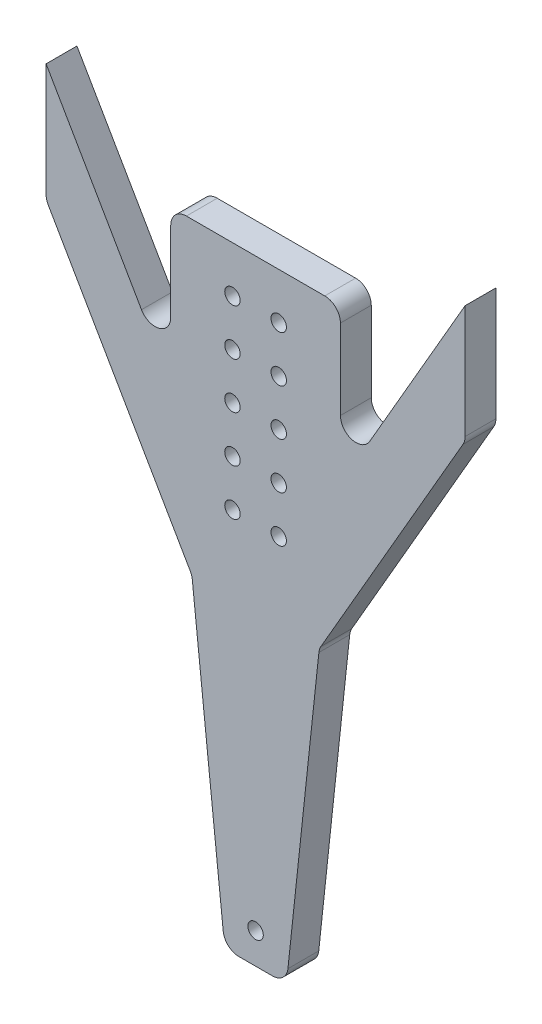
ISO-10303-21;
HEADER;
FILE_DESCRIPTION(('STEP AP214'),'2;1');
FILE_NAME('part.step','',(''),(''),'','','');
FILE_SCHEMA(('AUTOMOTIVE_DESIGN { 1 0 10303 214 1 1 1 1 }'));
ENDSEC;
DATA;
#1=APPLICATION_CONTEXT('core data for automotive mechanical design processes');
#2=APPLICATION_PROTOCOL_DEFINITION('international standard','automotive_design',2000,#1);
#3=PRODUCT_CONTEXT('',#1,'mechanical');
#4=PRODUCT('Part','Part','',(#3));
#5=PRODUCT_RELATED_PRODUCT_CATEGORY('part','',(#4));
#6=PRODUCT_DEFINITION_FORMATION('','',#4);
#7=PRODUCT_DEFINITION_CONTEXT('part definition',#1,'design');
#8=PRODUCT_DEFINITION('design','',#6,#7);
#9=PRODUCT_DEFINITION_SHAPE('','',#8);
#10=(LENGTH_UNIT() NAMED_UNIT(*) SI_UNIT(.MILLI.,.METRE.));
#11=(NAMED_UNIT(*) PLANE_ANGLE_UNIT() SI_UNIT($,.RADIAN.));
#12=(NAMED_UNIT(*) SI_UNIT($,.STERADIAN.) SOLID_ANGLE_UNIT());
#13=UNCERTAINTY_MEASURE_WITH_UNIT(LENGTH_MEASURE(1.E-05),#10,'distance_accuracy_value','');
#14=(GEOMETRIC_REPRESENTATION_CONTEXT(3) GLOBAL_UNCERTAINTY_ASSIGNED_CONTEXT((#13)) GLOBAL_UNIT_ASSIGNED_CONTEXT((#10,
#11,#12)) REPRESENTATION_CONTEXT('',''));
#15=CARTESIAN_POINT('',(0.,0.,0.));
#16=DIRECTION('',(0.,0.,1.));
#17=DIRECTION('',(1.,0.,0.));
#18=AXIS2_PLACEMENT_3D('',#15,#16,#17);
#19=CARTESIAN_POINT('',(7.5000000000001,85.,0.));
#20=DIRECTION('',(0.,0.,-1.));
#21=DIRECTION('',(-1.,0.,0.));
#22=AXIS2_PLACEMENT_3D('',#19,#20,#21);
#23=CYLINDRICAL_SURFACE('',#22,2.5);
#24=CARTESIAN_POINT('',(7.5000000000001,85.,10.));
#25=DIRECTION('',(0.,0.,-1.));
#26=DIRECTION('',(-1.,0.,0.));
#27=AXIS2_PLACEMENT_3D('',#24,#25,#26);
#28=CIRCLE('',#27,2.5);
#29=CARTESIAN_POINT('',(5.0000000000001,85.,10.));
#30=VERTEX_POINT('',#29);
#31=EDGE_CURVE('E49',#30,#30,#28,.T.);
#32=ORIENTED_EDGE('',*,*,#31,.F.);
#33=EDGE_LOOP('',(#32));
#34=FACE_BOUND('',#33,.T.);
#35=CARTESIAN_POINT('',(7.5000000000001,85.,0.));
#36=DIRECTION('',(0.,0.,-1.));
#37=DIRECTION('',(-1.,0.,0.));
#38=AXIS2_PLACEMENT_3D('',#35,#36,#37);
#39=CIRCLE('',#38,2.5);
#40=CARTESIAN_POINT('',(5.0000000000001,85.,0.));
#41=VERTEX_POINT('',#40);
#42=EDGE_CURVE('E11',#41,#41,#39,.T.);
#43=ORIENTED_EDGE('',*,*,#42,.T.);
#44=EDGE_LOOP('',(#43));
#45=FACE_BOUND('',#44,.T.);
#46=ADVANCED_FACE('F41',(#34,#45),#23,.F.);
#47=CARTESIAN_POINT('',(7.50000000000008,70.,0.));
#48=DIRECTION('',(0.,0.,-1.));
#49=DIRECTION('',(-1.,0.,0.));
#50=AXIS2_PLACEMENT_3D('',#47,#48,#49);
#51=CYLINDRICAL_SURFACE('',#50,2.5);
#52=CARTESIAN_POINT('',(7.50000000000008,70.,10.));
#53=DIRECTION('',(0.,0.,-1.));
#54=DIRECTION('',(-1.,0.,0.));
#55=AXIS2_PLACEMENT_3D('',#52,#53,#54);
#56=CIRCLE('',#55,2.5);
#57=CARTESIAN_POINT('',(5.00000000000008,70.,10.));
#58=VERTEX_POINT('',#57);
#59=EDGE_CURVE('E463',#58,#58,#56,.T.);
#60=ORIENTED_EDGE('',*,*,#59,.F.);
#61=EDGE_LOOP('',(#60));
#62=FACE_BOUND('',#61,.T.);
#63=CARTESIAN_POINT('',(7.50000000000008,70.,0.));
#64=DIRECTION('',(0.,0.,-1.));
#65=DIRECTION('',(-1.,0.,0.));
#66=AXIS2_PLACEMENT_3D('',#63,#64,#65);
#67=CIRCLE('',#66,2.5);
#68=CARTESIAN_POINT('',(5.00000000000008,70.,0.));
#69=VERTEX_POINT('',#68);
#70=EDGE_CURVE('E467',#69,#69,#67,.T.);
#71=ORIENTED_EDGE('',*,*,#70,.T.);
#72=EDGE_LOOP('',(#71));
#73=FACE_BOUND('',#72,.T.);
#74=ADVANCED_FACE('F477',(#62,#73),#51,.F.);
#75=CARTESIAN_POINT('',(7.50000000000005,55.,0.));
#76=DIRECTION('',(0.,0.,-1.));
#77=DIRECTION('',(-1.,0.,0.));
#78=AXIS2_PLACEMENT_3D('',#75,#76,#77);
#79=CYLINDRICAL_SURFACE('',#78,2.5);
#80=CARTESIAN_POINT('',(7.50000000000005,55.,10.));
#81=DIRECTION('',(0.,0.,-1.));
#82=DIRECTION('',(-1.,0.,0.));
#83=AXIS2_PLACEMENT_3D('',#80,#81,#82);
#84=CIRCLE('',#83,2.5);
#85=CARTESIAN_POINT('',(5.00000000000005,55.,10.));
#86=VERTEX_POINT('',#85);
#87=EDGE_CURVE('E455',#86,#86,#84,.T.);
#88=ORIENTED_EDGE('',*,*,#87,.F.);
#89=EDGE_LOOP('',(#88));
#90=FACE_BOUND('',#89,.T.);
#91=CARTESIAN_POINT('',(7.50000000000005,55.,0.));
#92=DIRECTION('',(0.,0.,-1.));
#93=DIRECTION('',(-1.,0.,0.));
#94=AXIS2_PLACEMENT_3D('',#91,#92,#93);
#95=CIRCLE('',#94,2.5);
#96=CARTESIAN_POINT('',(5.00000000000005,55.,0.));
#97=VERTEX_POINT('',#96);
#98=EDGE_CURVE('E459',#97,#97,#95,.T.);
#99=ORIENTED_EDGE('',*,*,#98,.T.);
#100=EDGE_LOOP('',(#99));
#101=FACE_BOUND('',#100,.T.);
#102=ADVANCED_FACE('F588',(#90,#101),#79,.F.);
#103=CARTESIAN_POINT('',(-7.4999999999999,85.,0.));
#104=DIRECTION('',(0.,0.,-1.));
#105=DIRECTION('',(-1.,0.,0.));
#106=AXIS2_PLACEMENT_3D('',#103,#104,#105);
#107=CYLINDRICAL_SURFACE('',#106,2.5);
#108=CARTESIAN_POINT('',(-7.4999999999999,85.,10.));
#109=DIRECTION('',(0.,0.,-1.));
#110=DIRECTION('',(-1.,0.,0.));
#111=AXIS2_PLACEMENT_3D('',#108,#109,#110);
#112=CIRCLE('',#111,2.5);
#113=CARTESIAN_POINT('',(-9.99999999999989,85.,10.));
#114=VERTEX_POINT('',#113);
#115=EDGE_CURVE('E447',#114,#114,#112,.T.);
#116=ORIENTED_EDGE('',*,*,#115,.F.);
#117=EDGE_LOOP('',(#116));
#118=FACE_BOUND('',#117,.T.);
#119=CARTESIAN_POINT('',(-7.4999999999999,85.,0.));
#120=DIRECTION('',(0.,0.,-1.));
#121=DIRECTION('',(-1.,0.,0.));
#122=AXIS2_PLACEMENT_3D('',#119,#120,#121);
#123=CIRCLE('',#122,2.5);
#124=CARTESIAN_POINT('',(-9.9999999999999,85.,0.));
#125=VERTEX_POINT('',#124);
#126=EDGE_CURVE('E451',#125,#125,#123,.T.);
#127=ORIENTED_EDGE('',*,*,#126,.T.);
#128=EDGE_LOOP('',(#127));
#129=FACE_BOUND('',#128,.T.);
#130=ADVANCED_FACE('F584',(#118,#129),#107,.F.);
#131=CARTESIAN_POINT('',(-7.49999999999992,70.,0.));
#132=DIRECTION('',(0.,0.,-1.));
#133=DIRECTION('',(-1.,0.,0.));
#134=AXIS2_PLACEMENT_3D('',#131,#132,#133);
#135=CYLINDRICAL_SURFACE('',#134,2.5);
#136=CARTESIAN_POINT('',(-7.49999999999992,70.,10.));
#137=DIRECTION('',(0.,0.,-1.));
#138=DIRECTION('',(-1.,0.,0.));
#139=AXIS2_PLACEMENT_3D('',#136,#137,#138);
#140=CIRCLE('',#139,2.5);
#141=CARTESIAN_POINT('',(-9.99999999999992,70.,10.));
#142=VERTEX_POINT('',#141);
#143=EDGE_CURVE('E439',#142,#142,#140,.T.);
#144=ORIENTED_EDGE('',*,*,#143,.F.);
#145=EDGE_LOOP('',(#144));
#146=FACE_BOUND('',#145,.T.);
#147=CARTESIAN_POINT('',(-7.49999999999992,70.,0.));
#148=DIRECTION('',(0.,0.,-1.));
#149=DIRECTION('',(-1.,0.,0.));
#150=AXIS2_PLACEMENT_3D('',#147,#148,#149);
#151=CIRCLE('',#150,2.5);
#152=CARTESIAN_POINT('',(-9.99999999999992,70.,0.));
#153=VERTEX_POINT('',#152);
#154=EDGE_CURVE('E443',#153,#153,#151,.T.);
#155=ORIENTED_EDGE('',*,*,#154,.T.);
#156=EDGE_LOOP('',(#155));
#157=FACE_BOUND('',#156,.T.);
#158=ADVANCED_FACE('F580',(#146,#157),#135,.F.);
#159=CARTESIAN_POINT('',(-7.49999999999995,55.,0.));
#160=DIRECTION('',(0.,0.,-1.));
#161=DIRECTION('',(-1.,0.,0.));
#162=AXIS2_PLACEMENT_3D('',#159,#160,#161);
#163=CYLINDRICAL_SURFACE('',#162,2.5);
#164=CARTESIAN_POINT('',(-7.49999999999995,55.,10.));
#165=DIRECTION('',(0.,0.,-1.));
#166=DIRECTION('',(-1.,0.,0.));
#167=AXIS2_PLACEMENT_3D('',#164,#165,#166);
#168=CIRCLE('',#167,2.5);
#169=CARTESIAN_POINT('',(-9.99999999999994,55.,10.));
#170=VERTEX_POINT('',#169);
#171=EDGE_CURVE('E431',#170,#170,#168,.T.);
#172=ORIENTED_EDGE('',*,*,#171,.F.);
#173=EDGE_LOOP('',(#172));
#174=FACE_BOUND('',#173,.T.);
#175=CARTESIAN_POINT('',(-7.49999999999995,55.,0.));
#176=DIRECTION('',(0.,0.,-1.));
#177=DIRECTION('',(-1.,0.,0.));
#178=AXIS2_PLACEMENT_3D('',#175,#176,#177);
#179=CIRCLE('',#178,2.5);
#180=CARTESIAN_POINT('',(-9.99999999999995,55.,0.));
#181=VERTEX_POINT('',#180);
#182=EDGE_CURVE('E435',#181,#181,#179,.T.);
#183=ORIENTED_EDGE('',*,*,#182,.T.);
#184=EDGE_LOOP('',(#183));
#185=FACE_BOUND('',#184,.T.);
#186=ADVANCED_FACE('F539',(#174,#185),#163,.F.);
#187=CARTESIAN_POINT('',(-27.5104682033564,50.,10.));
#188=DIRECTION('',(1.,0.,0.));
#189=DIRECTION('',(0.,0.,-1.));
#190=AXIS2_PLACEMENT_3D('',#187,#188,#189);
#191=PLANE('',#190);
#192=DIRECTION('',(0.,-1.,0.));
#193=VECTOR('',#192,1.);
#194=CARTESIAN_POINT('',(-27.5104682033564,50.,10.));
#195=LINE('',#194,#193);
#196=CARTESIAN_POINT('',(-27.5104682033564,94.9200000000001,10.));
#197=VERTEX_POINT('',#196);
#198=CARTESIAN_POINT('',(-27.5104682033564,68.9588181024498,10.));
#199=VERTEX_POINT('',#198);
#200=EDGE_CURVE('E207',#197,#199,#195,.T.);
#201=ORIENTED_EDGE('',*,*,#200,.F.);
#202=DIRECTION('',(0.,0.,-1.));
#203=VECTOR('',#202,1.);
#204=CARTESIAN_POINT('',(-27.5104682033564,94.9200000000001,10.));
#205=LINE('',#204,#203);
#206=CARTESIAN_POINT('',(-27.5104682033564,94.9200000000001,0.));
#207=VERTEX_POINT('',#206);
#208=EDGE_CURVE('E358',#197,#207,#205,.T.);
#209=ORIENTED_EDGE('',*,*,#208,.T.);
#210=DIRECTION('',(0.,-1.,0.));
#211=VECTOR('',#210,1.);
#212=CARTESIAN_POINT('',(-27.5104682033564,50.,0.));
#213=LINE('',#212,#211);
#214=CARTESIAN_POINT('',(-27.5104682033564,68.9588181024498,0.));
#215=VERTEX_POINT('',#214);
#216=EDGE_CURVE('E260',#207,#215,#213,.T.);
#217=ORIENTED_EDGE('',*,*,#216,.T.);
#218=DIRECTION('',(0.,0.,-1.));
#219=VECTOR('',#218,1.);
#220=CARTESIAN_POINT('',(-27.5104682033564,68.9588181024498,10.));
#221=LINE('',#220,#219);
#222=EDGE_CURVE('E355',#215,#199,#221,.F.);
#223=ORIENTED_EDGE('',*,*,#222,.T.);
#224=EDGE_LOOP('',(#201,#209,#217,#223));
#225=FACE_BOUND('',#224,.T.);
#226=ADVANCED_FACE('F537',(#225),#191,.F.);
#227=CARTESIAN_POINT('',(-67.9249870466306,120.,10.));
#228=DIRECTION('',(-0.866025403784437,-0.500000000000004,0.));
#229=DIRECTION('',(0.500000000000004,-0.866025403784437,0.));
#230=AXIS2_PLACEMENT_3D('',#227,#228,#229);
#231=PLANE('',#230);
#232=DIRECTION('',(-0.500000000000004,0.866025403784437,0.));
#233=VECTOR('',#232,1.);
#234=CARTESIAN_POINT('',(-67.9249870466306,120.,10.));
#235=LINE('',#234,#233);
#236=CARTESIAN_POINT('',(-36.9898772545813,66.4188181024497,10.));
#237=VERTEX_POINT('',#236);
#238=CARTESIAN_POINT('',(-67.9249870466306,120.,10.));
#239=VERTEX_POINT('',#238);
#240=EDGE_CURVE('E192',#237,#239,#235,.T.);
#241=ORIENTED_EDGE('',*,*,#240,.F.);
#242=DIRECTION('',(0.,0.,-1.));
#243=VECTOR('',#242,1.);
#244=CARTESIAN_POINT('',(-36.9898772545813,66.4188181024498,0.));
#245=LINE('',#244,#243);
#246=CARTESIAN_POINT('',(-36.9898772545813,66.4188181024497,0.));
#247=VERTEX_POINT('',#246);
#248=EDGE_CURVE('E364',#237,#247,#245,.T.);
#249=ORIENTED_EDGE('',*,*,#248,.T.);
#250=DIRECTION('',(-0.500000000000004,0.866025403784437,0.));
#251=VECTOR('',#250,1.);
#252=CARTESIAN_POINT('',(-67.9249870466306,120.,0.));
#253=LINE('',#252,#251);
#254=CARTESIAN_POINT('',(-67.9249870466306,120.,0.));
#255=VERTEX_POINT('',#254);
#256=EDGE_CURVE('E213',#247,#255,#253,.T.);
#257=ORIENTED_EDGE('',*,*,#256,.T.);
#258=DIRECTION('',(0.,0.,-1.));
#259=VECTOR('',#258,1.);
#260=CARTESIAN_POINT('',(-67.9249870466306,120.,10.));
#261=LINE('',#260,#259);
#262=EDGE_CURVE('E210',#239,#255,#261,.T.);
#263=ORIENTED_EDGE('',*,*,#262,.F.);
#264=EDGE_LOOP('',(#241,#249,#257,#263));
#265=FACE_BOUND('',#264,.T.);
#266=ADVANCED_FACE('F211',(#265),#231,.F.);
#267=CARTESIAN_POINT('',(-67.9249870466306,120.,10.));
#268=DIRECTION('',(1.,0.,0.));
#269=DIRECTION('',(0.,0.,-1.));
#270=AXIS2_PLACEMENT_3D('',#267,#268,#269);
#271=PLANE('',#270);
#272=DIRECTION('',(0.,-1.,0.));
#273=VECTOR('',#272,1.);
#274=CARTESIAN_POINT('',(-67.9249870466306,120.,0.));
#275=LINE('',#274,#273);
#276=CARTESIAN_POINT('',(-67.9249870466306,83.261181897551,0.));
#277=VERTEX_POINT('',#276);
#278=EDGE_CURVE('E267',#255,#277,#275,.T.);
#279=ORIENTED_EDGE('',*,*,#278,.T.);
#280=DIRECTION('',(0.,0.,-1.));
#281=VECTOR('',#280,1.);
#282=CARTESIAN_POINT('',(-67.9249870466306,83.261181897551,10.));
#283=LINE('',#282,#281);
#284=CARTESIAN_POINT('',(-67.9249870466306,83.261181897551,10.));
#285=VERTEX_POINT('',#284);
#286=EDGE_CURVE('E223',#277,#285,#283,.F.);
#287=ORIENTED_EDGE('',*,*,#286,.T.);
#288=DIRECTION('',(0.,-1.,0.));
#289=VECTOR('',#288,1.);
#290=CARTESIAN_POINT('',(-67.9249870466306,120.,10.));
#291=LINE('',#290,#289);
#292=EDGE_CURVE('E198',#239,#285,#291,.T.);
#293=ORIENTED_EDGE('',*,*,#292,.F.);
#294=ORIENTED_EDGE('',*,*,#262,.T.);
#295=EDGE_LOOP('',(#279,#287,#293,#294));
#296=FACE_BOUND('',#295,.T.);
#297=ADVANCED_FACE('F221',(#296),#271,.F.);
#298=CARTESIAN_POINT('',(-20.6399999999992,0.,10.));
#299=DIRECTION('',(0.866025403784436,0.500000000000004,0.));
#300=DIRECTION('',(-0.500000000000005,0.866025403784436,0.));
#301=AXIS2_PLACEMENT_3D('',#298,#299,#300);
#302=PLANE('',#301);
#303=DIRECTION('',(0.500000000000004,-0.866025403784436,0.));
#304=VECTOR('',#303,1.);
#305=CARTESIAN_POINT('',(-20.6399999999992,0.,10.));
#306=LINE('',#305,#304);
#307=CARTESIAN_POINT('',(-67.2443960978555,80.721181897551,10.));
#308=VERTEX_POINT('',#307);
#309=CARTESIAN_POINT('',(-21.1773959945488,0.930797166343919,10.));
#310=VERTEX_POINT('',#309);
#311=EDGE_CURVE('E225',#308,#310,#306,.T.);
#312=ORIENTED_EDGE('',*,*,#311,.F.);
#313=DIRECTION('',(0.,0.,-1.));
#314=VECTOR('',#313,1.);
#315=CARTESIAN_POINT('',(-67.2443960978555,80.721181897551,10.));
#316=LINE('',#315,#314);
#317=CARTESIAN_POINT('',(-67.2443960978555,80.721181897551,0.));
#318=VERTEX_POINT('',#317);
#319=EDGE_CURVE('E381',#308,#318,#316,.T.);
#320=ORIENTED_EDGE('',*,*,#319,.T.);
#321=DIRECTION('',(0.500000000000004,-0.866025403784436,0.));
#322=VECTOR('',#321,1.);
#323=CARTESIAN_POINT('',(-20.6399999999992,0.,0.));
#324=LINE('',#323,#322);
#325=CARTESIAN_POINT('',(-21.1773959945488,0.930797166343919,0.));
#326=VERTEX_POINT('',#325);
#327=EDGE_CURVE('E270',#318,#326,#324,.T.);
#328=ORIENTED_EDGE('',*,*,#327,.T.);
#329=DIRECTION('',(0.,0.,-1.));
#330=VECTOR('',#329,1.);
#331=CARTESIAN_POINT('',(-21.1773959945488,0.930797166343919,10.));
#332=LINE('',#331,#330);
#333=EDGE_CURVE('E378',#326,#310,#332,.F.);
#334=ORIENTED_EDGE('',*,*,#333,.T.);
#335=EDGE_LOOP('',(#312,#320,#328,#334));
#336=FACE_BOUND('',#335,.T.);
#337=ADVANCED_FACE('F528',(#336),#302,.F.);
#338=CARTESIAN_POINT('',(-10.,-99.4323408152499,10.));
#339=DIRECTION('',(0.994323408152499,0.106399999999992,0.));
#340=DIRECTION('',(-0.106399999999992,0.994323408152499,0.));
#341=AXIS2_PLACEMENT_3D('',#338,#339,#340);
#342=PLANE('',#341);
#343=DIRECTION('',(0.106399999999992,-0.994323408152499,0.));
#344=VECTOR('',#343,1.);
#345=CARTESIAN_POINT('',(-10.,-99.4323408152499,0.));
#346=LINE('',#345,#344);
#347=CARTESIAN_POINT('',(-20.525642132359,-1.06869083365617,0.));
#348=VERTEX_POINT('',#347);
#349=CARTESIAN_POINT('',(-10.4857589786581,-94.8928528152499,0.));
#350=VERTEX_POINT('',#349);
#351=EDGE_CURVE('E274',#348,#350,#346,.T.);
#352=ORIENTED_EDGE('',*,*,#351,.T.);
#353=DIRECTION('',(0.,0.,-1.));
#354=VECTOR('',#353,1.);
#355=CARTESIAN_POINT('',(-10.4857589786581,-94.8928528152499,10.));
#356=LINE('',#355,#354);
#357=CARTESIAN_POINT('',(-10.4857589786581,-94.8928528152499,10.));
#358=VERTEX_POINT('',#357);
#359=EDGE_CURVE('E398',#350,#358,#356,.F.);
#360=ORIENTED_EDGE('',*,*,#359,.T.);
#361=DIRECTION('',(0.106399999999992,-0.994323408152499,0.));
#362=VECTOR('',#361,1.);
#363=CARTESIAN_POINT('',(-10.,-99.4323408152499,10.));
#364=LINE('',#363,#362);
#365=CARTESIAN_POINT('',(-20.525642132359,-1.06869083365617,10.));
#366=VERTEX_POINT('',#365);
#367=EDGE_CURVE('E229',#366,#358,#364,.T.);
#368=ORIENTED_EDGE('',*,*,#367,.F.);
#369=DIRECTION('',(0.,0.,-1.));
#370=VECTOR('',#369,1.);
#371=CARTESIAN_POINT('',(-20.525642132359,-1.06869083365615,0.));
#372=LINE('',#371,#370);
#373=EDGE_CURVE('E394',#366,#348,#372,.T.);
#374=ORIENTED_EDGE('',*,*,#373,.T.);
#375=EDGE_LOOP('',(#352,#360,#368,#374));
#376=FACE_BOUND('',#375,.T.);
#377=ADVANCED_FACE('F524',(#376),#342,.F.);
#378=CARTESIAN_POINT('',(10.,-99.4323408152499,10.));
#379=DIRECTION('',(0.,1.,0.));
#380=DIRECTION('',(0.,0.,1.));
#381=AXIS2_PLACEMENT_3D('',#378,#379,#380);
#382=PLANE('',#381);
#383=DIRECTION('',(1.,0.,0.));
#384=VECTOR('',#383,1.);
#385=CARTESIAN_POINT('',(10.,-99.4323408152499,10.));
#386=LINE('',#385,#384);
#387=CARTESIAN_POINT('',(-5.43459606524337,-99.4323408152499,10.));
#388=VERTEX_POINT('',#387);
#389=CARTESIAN_POINT('',(5.43459606524337,-99.4323408152499,10.));
#390=VERTEX_POINT('',#389);
#391=EDGE_CURVE('E236',#388,#390,#386,.T.);
#392=ORIENTED_EDGE('',*,*,#391,.F.);
#393=DIRECTION('',(0.,0.,-1.));
#394=VECTOR('',#393,1.);
#395=CARTESIAN_POINT('',(-5.43459606524337,-99.4323408152499,10.));
#396=LINE('',#395,#394);
#397=CARTESIAN_POINT('',(-5.43459606524337,-99.4323408152499,0.));
#398=VERTEX_POINT('',#397);
#399=EDGE_CURVE('E390',#388,#398,#396,.T.);
#400=ORIENTED_EDGE('',*,*,#399,.T.);
#401=DIRECTION('',(1.,0.,0.));
#402=VECTOR('',#401,1.);
#403=CARTESIAN_POINT('',(10.,-99.4323408152499,0.));
#404=LINE('',#403,#402);
#405=CARTESIAN_POINT('',(5.43459606524337,-99.4323408152499,0.));
#406=VERTEX_POINT('',#405);
#407=EDGE_CURVE('E278',#398,#406,#404,.T.);
#408=ORIENTED_EDGE('',*,*,#407,.T.);
#409=DIRECTION('',(0.,0.,-1.));
#410=VECTOR('',#409,1.);
#411=CARTESIAN_POINT('',(5.43459606524337,-99.4323408152499,10.));
#412=LINE('',#411,#410);
#413=EDGE_CURVE('E387',#406,#390,#412,.F.);
#414=ORIENTED_EDGE('',*,*,#413,.T.);
#415=EDGE_LOOP('',(#392,#400,#408,#414));
#416=FACE_BOUND('',#415,.T.);
#417=ADVANCED_FACE('F520',(#416),#382,.F.);
#418=CARTESIAN_POINT('',(20.6399999999992,0.,10.));
#419=DIRECTION('',(-0.994323408152499,0.106399999999992,0.));
#420=DIRECTION('',(-0.106399999999992,-0.994323408152499,0.));
#421=AXIS2_PLACEMENT_3D('',#418,#419,#420);
#422=PLANE('',#421);
#423=DIRECTION('',(0.106399999999992,0.994323408152499,0.));
#424=VECTOR('',#423,1.);
#425=CARTESIAN_POINT('',(20.6399999999992,0.,10.));
#426=LINE('',#425,#424);
#427=CARTESIAN_POINT('',(10.4857589786581,-94.8928528152499,10.));
#428=VERTEX_POINT('',#427);
#429=CARTESIAN_POINT('',(20.5256421323591,-1.06869083365609,10.));
#430=VERTEX_POINT('',#429);
#431=EDGE_CURVE('E240',#428,#430,#426,.T.);
#432=ORIENTED_EDGE('',*,*,#431,.F.);
#433=DIRECTION('',(0.,0.,-1.));
#434=VECTOR('',#433,1.);
#435=CARTESIAN_POINT('',(10.4857589786581,-94.8928528152499,10.));
#436=LINE('',#435,#434);
#437=CARTESIAN_POINT('',(10.4857589786581,-94.8928528152499,0.));
#438=VERTEX_POINT('',#437);
#439=EDGE_CURVE('E404',#428,#438,#436,.T.);
#440=ORIENTED_EDGE('',*,*,#439,.T.);
#441=DIRECTION('',(0.106399999999992,0.994323408152499,0.));
#442=VECTOR('',#441,1.);
#443=CARTESIAN_POINT('',(20.6399999999992,0.,0.));
#444=LINE('',#443,#442);
#445=CARTESIAN_POINT('',(20.5256421323591,-1.06869083365609,0.));
#446=VERTEX_POINT('',#445);
#447=EDGE_CURVE('E282',#438,#446,#444,.T.);
#448=ORIENTED_EDGE('',*,*,#447,.T.);
#449=DIRECTION('',(0.,0.,-1.));
#450=VECTOR('',#449,1.);
#451=CARTESIAN_POINT('',(20.5256421323591,-1.06869083365609,10.));
#452=LINE('',#451,#450);
#453=EDGE_CURVE('E401',#446,#430,#452,.F.);
#454=ORIENTED_EDGE('',*,*,#453,.T.);
#455=EDGE_LOOP('',(#432,#440,#448,#454));
#456=FACE_BOUND('',#455,.T.);
#457=ADVANCED_FACE('F516',(#456),#422,.F.);
#458=CARTESIAN_POINT('',(67.9249870466299,81.9000000000008,10.));
#459=DIRECTION('',(-0.86602540378444,0.499999999999998,0.));
#460=DIRECTION('',(-0.499999999999998,-0.86602540378444,0.));
#461=AXIS2_PLACEMENT_3D('',#458,#459,#460);
#462=PLANE('',#461);
#463=DIRECTION('',(0.499999999999998,0.86602540378444,0.));
#464=VECTOR('',#463,1.);
#465=CARTESIAN_POINT('',(67.9249870466299,81.9000000000008,0.));
#466=LINE('',#465,#464);
#467=CARTESIAN_POINT('',(21.1773959945488,0.93079716634395,0.));
#468=VERTEX_POINT('',#467);
#469=CARTESIAN_POINT('',(67.2443960978548,80.7211818975509,0.));
#470=VERTEX_POINT('',#469);
#471=EDGE_CURVE('E286',#468,#470,#466,.T.);
#472=ORIENTED_EDGE('',*,*,#471,.T.);
#473=DIRECTION('',(0.,0.,-1.));
#474=VECTOR('',#473,1.);
#475=CARTESIAN_POINT('',(67.2443960978548,80.7211818975509,10.));
#476=LINE('',#475,#474);
#477=CARTESIAN_POINT('',(67.2443960978548,80.7211818975509,10.));
#478=VERTEX_POINT('',#477);
#479=EDGE_CURVE('E375',#470,#478,#476,.F.);
#480=ORIENTED_EDGE('',*,*,#479,.T.);
#481=DIRECTION('',(0.499999999999998,0.86602540378444,0.));
#482=VECTOR('',#481,1.);
#483=CARTESIAN_POINT('',(67.9249870466299,81.9000000000008,10.));
#484=LINE('',#483,#482);
#485=CARTESIAN_POINT('',(21.1773959945488,0.93079716634395,10.));
#486=VERTEX_POINT('',#485);
#487=EDGE_CURVE('E244',#486,#478,#484,.T.);
#488=ORIENTED_EDGE('',*,*,#487,.F.);
#489=DIRECTION('',(0.,0.,-1.));
#490=VECTOR('',#489,1.);
#491=CARTESIAN_POINT('',(21.1773959945488,0.930797166343934,0.));
#492=LINE('',#491,#490);
#493=EDGE_CURVE('E371',#486,#468,#492,.T.);
#494=ORIENTED_EDGE('',*,*,#493,.T.);
#495=EDGE_LOOP('',(#472,#480,#488,#494));
#496=FACE_BOUND('',#495,.T.);
#497=ADVANCED_FACE('F512',(#496),#462,.F.);
#498=CARTESIAN_POINT('',(67.9249870466299,120.,10.));
#499=DIRECTION('',(-1.,0.,0.));
#500=DIRECTION('',(0.,-1.,0.));
#501=AXIS2_PLACEMENT_3D('',#498,#499,#500);
#502=PLANE('',#501);
#503=DIRECTION('',(0.,1.,0.));
#504=VECTOR('',#503,1.);
#505=CARTESIAN_POINT('',(67.9249870466299,120.,10.));
#506=LINE('',#505,#504);
#507=CARTESIAN_POINT('',(67.9249870466299,83.2611818975509,10.));
#508=VERTEX_POINT('',#507);
#509=CARTESIAN_POINT('',(67.9249870466299,120.,10.));
#510=VERTEX_POINT('',#509);
#511=EDGE_CURVE('E247',#508,#510,#506,.T.);
#512=ORIENTED_EDGE('',*,*,#511,.F.);
#513=DIRECTION('',(0.,0.,-1.));
#514=VECTOR('',#513,1.);
#515=CARTESIAN_POINT('',(67.9249870466299,83.2611818975509,10.));
#516=LINE('',#515,#514);
#517=CARTESIAN_POINT('',(67.9249870466299,83.2611818975509,0.));
#518=VERTEX_POINT('',#517);
#519=EDGE_CURVE('E367',#508,#518,#516,.T.);
#520=ORIENTED_EDGE('',*,*,#519,.T.);
#521=DIRECTION('',(0.,1.,0.));
#522=VECTOR('',#521,1.);
#523=CARTESIAN_POINT('',(67.9249870466299,120.,0.));
#524=LINE('',#523,#522);
#525=CARTESIAN_POINT('',(67.9249870466299,120.,0.));
#526=VERTEX_POINT('',#525);
#527=EDGE_CURVE('E290',#518,#526,#524,.T.);
#528=ORIENTED_EDGE('',*,*,#527,.T.);
#529=DIRECTION('',(0.,0.,-1.));
#530=VECTOR('',#529,1.);
#531=CARTESIAN_POINT('',(67.9249870466299,120.,10.));
#532=LINE('',#531,#530);
#533=EDGE_CURVE('E219',#510,#526,#532,.T.);
#534=ORIENTED_EDGE('',*,*,#533,.F.);
#535=EDGE_LOOP('',(#512,#520,#528,#534));
#536=FACE_BOUND('',#535,.T.);
#537=ADVANCED_FACE('F509',(#536),#502,.F.);
#538=CARTESIAN_POINT('',(27.5104682033562,50.,10.));
#539=DIRECTION('',(0.866025403784439,-0.499999999999999,0.));
#540=DIRECTION('',(0.499999999999999,0.866025403784439,0.));
#541=AXIS2_PLACEMENT_3D('',#538,#539,#540);
#542=PLANE('',#541);
#543=DIRECTION('',(-0.499999999999999,-0.866025403784439,0.));
#544=VECTOR('',#543,1.);
#545=CARTESIAN_POINT('',(27.5104682033562,50.,0.));
#546=LINE('',#545,#544);
#547=CARTESIAN_POINT('',(36.9898772545812,66.41881810245,0.));
#548=VERTEX_POINT('',#547);
#549=EDGE_CURVE('E293',#526,#548,#546,.T.);
#550=ORIENTED_EDGE('',*,*,#549,.T.);
#551=DIRECTION('',(0.,0.,-1.));
#552=VECTOR('',#551,1.);
#553=CARTESIAN_POINT('',(36.9898772545812,66.41881810245,10.));
#554=LINE('',#553,#552);
#555=CARTESIAN_POINT('',(36.9898772545812,66.41881810245,10.));
#556=VERTEX_POINT('',#555);
#557=EDGE_CURVE('E56',#548,#556,#554,.F.);
#558=ORIENTED_EDGE('',*,*,#557,.T.);
#559=DIRECTION('',(-0.499999999999999,-0.866025403784439,0.));
#560=VECTOR('',#559,1.);
#561=CARTESIAN_POINT('',(27.5104682033562,50.,10.));
#562=LINE('',#561,#560);
#563=EDGE_CURVE('E250',#510,#556,#562,.T.);
#564=ORIENTED_EDGE('',*,*,#563,.F.);
#565=ORIENTED_EDGE('',*,*,#533,.T.);
#566=EDGE_LOOP('',(#550,#558,#564,#565));
#567=FACE_BOUND('',#566,.T.);
#568=ADVANCED_FACE('F505',(#567),#542,.F.);
#569=CARTESIAN_POINT('',(27.5104682033563,100.,10.));
#570=DIRECTION('',(-1.,0.,0.));
#571=DIRECTION('',(0.,-1.,0.));
#572=AXIS2_PLACEMENT_3D('',#569,#570,#571);
#573=PLANE('',#572);
#574=DIRECTION('',(0.,1.,0.));
#575=VECTOR('',#574,1.);
#576=CARTESIAN_POINT('',(27.5104682033563,100.,0.));
#577=LINE('',#576,#575);
#578=CARTESIAN_POINT('',(27.5104682033563,68.95881810245,0.));
#579=VERTEX_POINT('',#578);
#580=CARTESIAN_POINT('',(27.5104682033563,94.9200000000001,0.));
#581=VERTEX_POINT('',#580);
#582=EDGE_CURVE('E296',#579,#581,#577,.T.);
#583=ORIENTED_EDGE('',*,*,#582,.T.);
#584=DIRECTION('',(0.,0.,-1.));
#585=VECTOR('',#584,1.);
#586=CARTESIAN_POINT('',(27.5104682033563,94.9200000000001,10.));
#587=LINE('',#586,#585);
#588=CARTESIAN_POINT('',(27.5104682033563,94.9200000000001,10.));
#589=VERTEX_POINT('',#588);
#590=EDGE_CURVE('E335',#581,#589,#587,.F.);
#591=ORIENTED_EDGE('',*,*,#590,.T.);
#592=DIRECTION('',(0.,1.,0.));
#593=VECTOR('',#592,1.);
#594=CARTESIAN_POINT('',(27.5104682033563,100.,10.));
#595=LINE('',#594,#593);
#596=CARTESIAN_POINT('',(27.5104682033563,68.95881810245,10.));
#597=VERTEX_POINT('',#596);
#598=EDGE_CURVE('E253',#597,#589,#595,.T.);
#599=ORIENTED_EDGE('',*,*,#598,.F.);
#600=DIRECTION('',(0.,0.,-1.));
#601=VECTOR('',#600,1.);
#602=CARTESIAN_POINT('',(27.5104682033563,68.95881810245,0.));
#603=LINE('',#602,#601);
#604=EDGE_CURVE('E331',#597,#579,#603,.T.);
#605=ORIENTED_EDGE('',*,*,#604,.T.);
#606=EDGE_LOOP('',(#583,#591,#599,#605));
#607=FACE_BOUND('',#606,.T.);
#608=ADVANCED_FACE('F501',(#607),#573,.F.);
#609=CARTESIAN_POINT('',(-27.5104682033564,100.,10.));
#610=DIRECTION('',(0.,-1.,0.));
#611=DIRECTION('',(1.,0.,0.));
#612=AXIS2_PLACEMENT_3D('',#609,#610,#611);
#613=PLANE('',#612);
#614=DIRECTION('',(-1.,0.,0.));
#615=VECTOR('',#614,1.);
#616=CARTESIAN_POINT('',(-27.5104682033564,100.,10.));
#617=LINE('',#616,#615);
#618=CARTESIAN_POINT('',(22.4304682033563,100.,10.));
#619=VERTEX_POINT('',#618);
#620=CARTESIAN_POINT('',(-22.4304682033564,100.,10.));
#621=VERTEX_POINT('',#620);
#622=EDGE_CURVE('E256',#619,#621,#617,.T.);
#623=ORIENTED_EDGE('',*,*,#622,.F.);
#624=DIRECTION('',(0.,0.,-1.));
#625=VECTOR('',#624,1.);
#626=CARTESIAN_POINT('',(22.4304682033563,100.,10.));
#627=LINE('',#626,#625);
#628=CARTESIAN_POINT('',(22.4304682033563,100.,0.));
#629=VERTEX_POINT('',#628);
#630=EDGE_CURVE('E309',#619,#629,#627,.T.);
#631=ORIENTED_EDGE('',*,*,#630,.T.);
#632=DIRECTION('',(-1.,0.,0.));
#633=VECTOR('',#632,1.);
#634=CARTESIAN_POINT('',(-27.5104682033564,100.,0.));
#635=LINE('',#634,#633);
#636=CARTESIAN_POINT('',(-22.4304682033564,100.,0.));
#637=VERTEX_POINT('',#636);
#638=EDGE_CURVE('E300',#629,#637,#635,.T.);
#639=ORIENTED_EDGE('',*,*,#638,.T.);
#640=DIRECTION('',(0.,0.,-1.));
#641=VECTOR('',#640,1.);
#642=CARTESIAN_POINT('',(-22.4304682033564,100.,10.));
#643=LINE('',#642,#641);
#644=EDGE_CURVE('E218',#637,#621,#643,.F.);
#645=ORIENTED_EDGE('',*,*,#644,.T.);
#646=EDGE_LOOP('',(#623,#631,#639,#645));
#647=FACE_BOUND('',#646,.T.);
#648=ADVANCED_FACE('F492',(#647),#613,.F.);
#649=CARTESIAN_POINT('',(0.,0.,10.));
#650=DIRECTION('',(0.,0.,-1.));
#651=DIRECTION('',(-1.,0.,0.));
#652=AXIS2_PLACEMENT_3D('',#649,#650,#651);
#653=PLANE('',#652);
#654=CARTESIAN_POINT('',(7.50000000000002,40.,10.));
#655=DIRECTION('',(0.,0.,-1.));
#656=DIRECTION('',(-1.,0.,0.));
#657=AXIS2_PLACEMENT_3D('',#654,#655,#656);
#658=CIRCLE('',#657,2.5);
#659=CARTESIAN_POINT('',(5.00000000000003,40.,10.));
#660=VERTEX_POINT('',#659);
#661=EDGE_CURVE('E812',#660,#660,#658,.T.);
#662=ORIENTED_EDGE('',*,*,#661,.T.);
#663=EDGE_LOOP('',(#662));
#664=FACE_BOUND('',#663,.T.);
#665=CARTESIAN_POINT('',(-7.49999999999997,40.,10.));
#666=DIRECTION('',(0.,0.,-1.));
#667=DIRECTION('',(-1.,0.,0.));
#668=AXIS2_PLACEMENT_3D('',#665,#666,#667);
#669=CIRCLE('',#668,2.5);
#670=CARTESIAN_POINT('',(-9.99999999999997,40.,10.));
#671=VERTEX_POINT('',#670);
#672=EDGE_CURVE('E804',#671,#671,#669,.T.);
#673=ORIENTED_EDGE('',*,*,#672,.T.);
#674=EDGE_LOOP('',(#673));
#675=FACE_BOUND('',#674,.T.);
#676=CARTESIAN_POINT('',(0.,-89.4323408152499,10.));
#677=DIRECTION('',(0.,0.,1.));
#678=DIRECTION('',(1.,0.,0.));
#679=AXIS2_PLACEMENT_3D('',#676,#677,#678);
#680=CIRCLE('',#679,2.5);
#681=CARTESIAN_POINT('',(2.5,-89.4323408152499,10.));
#682=VERTEX_POINT('',#681);
#683=EDGE_CURVE('E793',#682,#682,#680,.T.);
#684=ORIENTED_EDGE('',*,*,#683,.F.);
#685=EDGE_LOOP('',(#684));
#686=FACE_BOUND('',#685,.T.);
#687=CARTESIAN_POINT('',(-7.5,25.,10.));
#688=DIRECTION('',(0.,0.,-1.));
#689=DIRECTION('',(-1.,0.,0.));
#690=AXIS2_PLACEMENT_3D('',#687,#688,#689);
#691=CIRCLE('',#690,2.5);
#692=CARTESIAN_POINT('',(-10.,25.,10.));
#693=VERTEX_POINT('',#692);
#694=EDGE_CURVE('E723',#693,#693,#691,.T.);
#695=ORIENTED_EDGE('',*,*,#694,.T.);
#696=EDGE_LOOP('',(#695));
#697=FACE_BOUND('',#696,.T.);
#698=CARTESIAN_POINT('',(7.5,25.,10.));
#699=DIRECTION('',(0.,0.,-1.));
#700=DIRECTION('',(-1.,0.,0.));
#701=AXIS2_PLACEMENT_3D('',#698,#699,#700);
#702=CIRCLE('',#701,2.5);
#703=CARTESIAN_POINT('',(5.,25.,10.));
#704=VERTEX_POINT('',#703);
#705=EDGE_CURVE('E264',#704,#704,#702,.T.);
#706=ORIENTED_EDGE('',*,*,#705,.T.);
#707=EDGE_LOOP('',(#706));
#708=FACE_BOUND('',#707,.T.);
#709=ORIENTED_EDGE('',*,*,#598,.T.);
#710=CARTESIAN_POINT('',(22.4304682033563,94.9200000000001,10.));
#711=DIRECTION('',(0.,0.,-1.));
#712=DIRECTION('',(-1.,0.,0.));
#713=AXIS2_PLACEMENT_3D('',#710,#711,#712);
#714=CIRCLE('',#713,5.08);
#715=EDGE_CURVE('E352',#589,#619,#714,.F.);
#716=ORIENTED_EDGE('',*,*,#715,.T.);
#717=ORIENTED_EDGE('',*,*,#622,.T.);
#718=CARTESIAN_POINT('',(-22.4304682033564,94.9200000000001,10.));
#719=DIRECTION('',(0.,0.,-1.));
#720=DIRECTION('',(-1.,0.,0.));
#721=AXIS2_PLACEMENT_3D('',#718,#719,#720);
#722=CIRCLE('',#721,5.08);
#723=EDGE_CURVE('E349',#621,#197,#722,.F.);
#724=ORIENTED_EDGE('',*,*,#723,.T.);
#725=ORIENTED_EDGE('',*,*,#200,.T.);
#726=CARTESIAN_POINT('',(-32.5904682033564,68.9588181024498,10.));
#727=DIRECTION('',(0.,0.,-1.));
#728=DIRECTION('',(-1.,0.,0.));
#729=AXIS2_PLACEMENT_3D('',#726,#727,#728);
#730=CIRCLE('',#729,5.08);
#731=EDGE_CURVE('E202',#199,#237,#730,.T.);
#732=ORIENTED_EDGE('',*,*,#731,.T.);
#733=ORIENTED_EDGE('',*,*,#240,.T.);
#734=ORIENTED_EDGE('',*,*,#292,.T.);
#735=CARTESIAN_POINT('',(-62.8449870466306,83.261181897551,10.));
#736=DIRECTION('',(0.,0.,-1.));
#737=DIRECTION('',(-1.,0.,0.));
#738=AXIS2_PLACEMENT_3D('',#735,#736,#737);
#739=CIRCLE('',#738,5.08);
#740=EDGE_CURVE('E344',#285,#308,#739,.F.);
#741=ORIENTED_EDGE('',*,*,#740,.T.);
#742=ORIENTED_EDGE('',*,*,#311,.T.);
#743=CARTESIAN_POINT('',(-25.5768050457737,-1.60920283365611,10.));
#744=DIRECTION('',(0.,0.,-1.));
#745=DIRECTION('',(-1.,0.,0.));
#746=AXIS2_PLACEMENT_3D('',#743,#744,#745);
#747=CIRCLE('',#746,5.08);
#748=EDGE_CURVE('E428',#310,#366,#747,.T.);
#749=ORIENTED_EDGE('',*,*,#748,.T.);
#750=ORIENTED_EDGE('',*,*,#367,.T.);
#751=CARTESIAN_POINT('',(-5.43459606524337,-94.3523408152499,10.));
#752=DIRECTION('',(0.,0.,-1.));
#753=DIRECTION('',(-1.,0.,0.));
#754=AXIS2_PLACEMENT_3D('',#751,#752,#753);
#755=CIRCLE('',#754,5.08);
#756=EDGE_CURVE('E341',#358,#388,#755,.F.);
#757=ORIENTED_EDGE('',*,*,#756,.T.);
#758=ORIENTED_EDGE('',*,*,#391,.T.);
#759=CARTESIAN_POINT('',(5.43459606524337,-94.3523408152499,10.));
#760=DIRECTION('',(0.,0.,-1.));
#761=DIRECTION('',(-1.,0.,0.));
#762=AXIS2_PLACEMENT_3D('',#759,#760,#761);
#763=CIRCLE('',#762,5.08);
#764=EDGE_CURVE('E338',#390,#428,#763,.F.);
#765=ORIENTED_EDGE('',*,*,#764,.T.);
#766=ORIENTED_EDGE('',*,*,#431,.T.);
#767=CARTESIAN_POINT('',(25.5768050457738,-1.60920283365605,10.));
#768=DIRECTION('',(0.,0.,-1.));
#769=DIRECTION('',(-1.,0.,0.));
#770=AXIS2_PLACEMENT_3D('',#767,#768,#769);
#771=CIRCLE('',#770,5.08);
#772=EDGE_CURVE('E422',#430,#486,#771,.T.);
#773=ORIENTED_EDGE('',*,*,#772,.T.);
#774=ORIENTED_EDGE('',*,*,#487,.T.);
#775=CARTESIAN_POINT('',(62.8449870466298,83.2611818975509,10.));
#776=DIRECTION('',(0.,0.,-1.));
#777=DIRECTION('',(-1.,0.,0.));
#778=AXIS2_PLACEMENT_3D('',#775,#776,#777);
#779=CIRCLE('',#778,5.08);
#780=EDGE_CURVE('E64',#478,#508,#779,.F.);
#781=ORIENTED_EDGE('',*,*,#780,.T.);
#782=ORIENTED_EDGE('',*,*,#511,.T.);
#783=ORIENTED_EDGE('',*,*,#563,.T.);
#784=CARTESIAN_POINT('',(32.5904682033563,68.95881810245,10.));
#785=DIRECTION('',(0.,0.,-1.));
#786=DIRECTION('',(-1.,0.,0.));
#787=AXIS2_PLACEMENT_3D('',#784,#785,#786);
#788=CIRCLE('',#787,5.08);
#789=EDGE_CURVE('E411',#556,#597,#788,.T.);
#790=ORIENTED_EDGE('',*,*,#789,.T.);
#791=EDGE_LOOP('',(#709,#716,#717,#724,#725,#732,#733,#734,#741,#742,#749,#750,#757,#758,#765,
#766,#773,#774,#781,#782,#783,#790));
#792=FACE_BOUND('',#791,.T.);
#793=ORIENTED_EDGE('',*,*,#171,.T.);
#794=EDGE_LOOP('',(#793));
#795=FACE_BOUND('',#794,.T.);
#796=ORIENTED_EDGE('',*,*,#143,.T.);
#797=EDGE_LOOP('',(#796));
#798=FACE_BOUND('',#797,.T.);
#799=ORIENTED_EDGE('',*,*,#115,.T.);
#800=EDGE_LOOP('',(#799));
#801=FACE_BOUND('',#800,.T.);
#802=ORIENTED_EDGE('',*,*,#87,.T.);
#803=EDGE_LOOP('',(#802));
#804=FACE_BOUND('',#803,.T.);
#805=ORIENTED_EDGE('',*,*,#59,.T.);
#806=EDGE_LOOP('',(#805));
#807=FACE_BOUND('',#806,.T.);
#808=ORIENTED_EDGE('',*,*,#31,.T.);
#809=EDGE_LOOP('',(#808));
#810=FACE_BOUND('',#809,.T.);
#811=ADVANCED_FACE('F195',(#664,#675,#686,#697,#708,#792,#795,#798,#801,#804,#807,#810),#653,.F.);
#812=CARTESIAN_POINT('',(0.,0.,0.));
#813=DIRECTION('',(0.,0.,-1.));
#814=DIRECTION('',(-1.,0.,0.));
#815=AXIS2_PLACEMENT_3D('',#812,#813,#814);
#816=PLANE('',#815);
#817=CARTESIAN_POINT('',(7.50000000000002,40.,0.));
#818=DIRECTION('',(0.,0.,-1.));
#819=DIRECTION('',(-1.,0.,0.));
#820=AXIS2_PLACEMENT_3D('',#817,#818,#819);
#821=CIRCLE('',#820,2.5);
#822=CARTESIAN_POINT('',(5.00000000000002,40.,0.));
#823=VERTEX_POINT('',#822);
#824=EDGE_CURVE('E808',#823,#823,#821,.T.);
#825=ORIENTED_EDGE('',*,*,#824,.F.);
#826=EDGE_LOOP('',(#825));
#827=FACE_BOUND('',#826,.T.);
#828=CARTESIAN_POINT('',(-7.49999999999997,40.,0.));
#829=DIRECTION('',(0.,0.,-1.));
#830=DIRECTION('',(-1.,0.,0.));
#831=AXIS2_PLACEMENT_3D('',#828,#829,#830);
#832=CIRCLE('',#831,2.5);
#833=CARTESIAN_POINT('',(-9.99999999999997,40.,0.));
#834=VERTEX_POINT('',#833);
#835=EDGE_CURVE('E797',#834,#834,#832,.T.);
#836=ORIENTED_EDGE('',*,*,#835,.F.);
#837=EDGE_LOOP('',(#836));
#838=FACE_BOUND('',#837,.T.);
#839=CARTESIAN_POINT('',(0.,-89.4323408152499,0.));
#840=DIRECTION('',(0.,0.,1.));
#841=DIRECTION('',(1.,0.,0.));
#842=AXIS2_PLACEMENT_3D('',#839,#840,#841);
#843=CIRCLE('',#842,2.5);
#844=CARTESIAN_POINT('',(2.5,-89.4323408152499,0.));
#845=VERTEX_POINT('',#844);
#846=EDGE_CURVE('E792',#845,#845,#843,.T.);
#847=ORIENTED_EDGE('',*,*,#846,.T.);
#848=EDGE_LOOP('',(#847));
#849=FACE_BOUND('',#848,.T.);
#850=CARTESIAN_POINT('',(-7.5,25.,0.));
#851=DIRECTION('',(0.,0.,-1.));
#852=DIRECTION('',(-1.,0.,0.));
#853=AXIS2_PLACEMENT_3D('',#850,#851,#852);
#854=CIRCLE('',#853,2.5);
#855=CARTESIAN_POINT('',(-10.,25.,0.));
#856=VERTEX_POINT('',#855);
#857=EDGE_CURVE('E729',#856,#856,#854,.T.);
#858=ORIENTED_EDGE('',*,*,#857,.F.);
#859=EDGE_LOOP('',(#858));
#860=FACE_BOUND('',#859,.T.);
#861=CARTESIAN_POINT('',(7.5,25.,0.));
#862=DIRECTION('',(0.,0.,-1.));
#863=DIRECTION('',(-1.,0.,0.));
#864=AXIS2_PLACEMENT_3D('',#861,#862,#863);
#865=CIRCLE('',#864,2.5);
#866=CARTESIAN_POINT('',(5.,25.,0.));
#867=VERTEX_POINT('',#866);
#868=EDGE_CURVE('E720',#867,#867,#865,.T.);
#869=ORIENTED_EDGE('',*,*,#868,.F.);
#870=EDGE_LOOP('',(#869));
#871=FACE_BOUND('',#870,.T.);
#872=ORIENTED_EDGE('',*,*,#638,.F.);
#873=CARTESIAN_POINT('',(22.4304682033563,94.9200000000001,0.));
#874=DIRECTION('',(0.,0.,-1.));
#875=DIRECTION('',(-1.,0.,0.));
#876=AXIS2_PLACEMENT_3D('',#873,#874,#875);
#877=CIRCLE('',#876,5.08);
#878=EDGE_CURVE('E328',#629,#581,#877,.T.);
#879=ORIENTED_EDGE('',*,*,#878,.T.);
#880=ORIENTED_EDGE('',*,*,#582,.F.);
#881=CARTESIAN_POINT('',(32.5904682033563,68.95881810245,0.));
#882=DIRECTION('',(0.,0.,-1.));
#883=DIRECTION('',(-1.,0.,0.));
#884=AXIS2_PLACEMENT_3D('',#881,#882,#883);
#885=CIRCLE('',#884,5.08);
#886=EDGE_CURVE('E408',#579,#548,#885,.F.);
#887=ORIENTED_EDGE('',*,*,#886,.T.);
#888=ORIENTED_EDGE('',*,*,#549,.F.);
#889=ORIENTED_EDGE('',*,*,#527,.F.);
#890=CARTESIAN_POINT('',(62.8449870466298,83.2611818975509,0.));
#891=DIRECTION('',(0.,0.,-1.));
#892=DIRECTION('',(-1.,0.,0.));
#893=AXIS2_PLACEMENT_3D('',#890,#891,#892);
#894=CIRCLE('',#893,5.08);
#895=EDGE_CURVE('E322',#518,#470,#894,.T.);
#896=ORIENTED_EDGE('',*,*,#895,.T.);
#897=ORIENTED_EDGE('',*,*,#471,.F.);
#898=CARTESIAN_POINT('',(25.5768050457738,-1.60920283365605,0.));
#899=DIRECTION('',(0.,0.,-1.));
#900=DIRECTION('',(-1.,0.,0.));
#901=AXIS2_PLACEMENT_3D('',#898,#899,#900);
#902=CIRCLE('',#901,5.08);
#903=EDGE_CURVE('E419',#468,#446,#902,.F.);
#904=ORIENTED_EDGE('',*,*,#903,.T.);
#905=ORIENTED_EDGE('',*,*,#447,.F.);
#906=CARTESIAN_POINT('',(5.43459606524337,-94.3523408152499,0.));
#907=DIRECTION('',(0.,0.,-1.));
#908=DIRECTION('',(-1.,0.,0.));
#909=AXIS2_PLACEMENT_3D('',#906,#907,#908);
#910=CIRCLE('',#909,5.08);
#911=EDGE_CURVE('E313',#438,#406,#910,.T.);
#912=ORIENTED_EDGE('',*,*,#911,.T.);
#913=ORIENTED_EDGE('',*,*,#407,.F.);
#914=CARTESIAN_POINT('',(-5.43459606524337,-94.3523408152499,0.));
#915=DIRECTION('',(0.,0.,-1.));
#916=DIRECTION('',(-1.,0.,0.));
#917=AXIS2_PLACEMENT_3D('',#914,#915,#916);
#918=CIRCLE('',#917,5.08);
#919=EDGE_CURVE('E316',#398,#350,#918,.T.);
#920=ORIENTED_EDGE('',*,*,#919,.T.);
#921=ORIENTED_EDGE('',*,*,#351,.F.);
#922=CARTESIAN_POINT('',(-25.5768050457737,-1.60920283365611,0.));
#923=DIRECTION('',(0.,0.,-1.));
#924=DIRECTION('',(-1.,0.,0.));
#925=AXIS2_PLACEMENT_3D('',#922,#923,#924);
#926=CIRCLE('',#925,5.08);
#927=EDGE_CURVE('E425',#348,#326,#926,.F.);
#928=ORIENTED_EDGE('',*,*,#927,.T.);
#929=ORIENTED_EDGE('',*,*,#327,.F.);
#930=CARTESIAN_POINT('',(-62.8449870466306,83.261181897551,0.));
#931=DIRECTION('',(0.,0.,-1.));
#932=DIRECTION('',(-1.,0.,0.));
#933=AXIS2_PLACEMENT_3D('',#930,#931,#932);
#934=CIRCLE('',#933,5.08);
#935=EDGE_CURVE('E319',#318,#277,#934,.T.);
#936=ORIENTED_EDGE('',*,*,#935,.T.);
#937=ORIENTED_EDGE('',*,*,#278,.F.);
#938=ORIENTED_EDGE('',*,*,#256,.F.);
#939=CARTESIAN_POINT('',(-32.5904682033564,68.9588181024498,0.));
#940=DIRECTION('',(0.,0.,-1.));
#941=DIRECTION('',(-1.,0.,0.));
#942=AXIS2_PLACEMENT_3D('',#939,#940,#941);
#943=CIRCLE('',#942,5.08);
#944=EDGE_CURVE('E414',#247,#215,#943,.F.);
#945=ORIENTED_EDGE('',*,*,#944,.T.);
#946=ORIENTED_EDGE('',*,*,#216,.F.);
#947=CARTESIAN_POINT('',(-22.4304682033564,94.9200000000001,0.));
#948=DIRECTION('',(0.,0.,-1.));
#949=DIRECTION('',(-1.,0.,0.));
#950=AXIS2_PLACEMENT_3D('',#947,#948,#949);
#951=CIRCLE('',#950,5.08);
#952=EDGE_CURVE('E325',#207,#637,#951,.T.);
#953=ORIENTED_EDGE('',*,*,#952,.T.);
#954=EDGE_LOOP('',(#872,#879,#880,#887,#888,#889,#896,#897,#904,#905,#912,#913,#920,#921,#928,
#929,#936,#937,#938,#945,#946,#953));
#955=FACE_BOUND('',#954,.T.);
#956=ORIENTED_EDGE('',*,*,#182,.F.);
#957=EDGE_LOOP('',(#956));
#958=FACE_BOUND('',#957,.T.);
#959=ORIENTED_EDGE('',*,*,#154,.F.);
#960=EDGE_LOOP('',(#959));
#961=FACE_BOUND('',#960,.T.);
#962=ORIENTED_EDGE('',*,*,#126,.F.);
#963=EDGE_LOOP('',(#962));
#964=FACE_BOUND('',#963,.T.);
#965=ORIENTED_EDGE('',*,*,#98,.F.);
#966=EDGE_LOOP('',(#965));
#967=FACE_BOUND('',#966,.T.);
#968=ORIENTED_EDGE('',*,*,#70,.F.);
#969=EDGE_LOOP('',(#968));
#970=FACE_BOUND('',#969,.T.);
#971=ORIENTED_EDGE('',*,*,#42,.F.);
#972=EDGE_LOOP('',(#971));
#973=FACE_BOUND('',#972,.T.);
#974=ADVANCED_FACE('F480',(#827,#838,#849,#860,#871,#955,#958,#961,#964,#967,#970,#973),#816,.T.);
#975=CARTESIAN_POINT('',(22.4304682033563,94.9200000000001,10.));
#976=DIRECTION('',(0.,0.,-1.));
#977=DIRECTION('',(-1.,0.,0.));
#978=AXIS2_PLACEMENT_3D('',#975,#976,#977);
#979=CYLINDRICAL_SURFACE('',#978,5.08);
#980=ORIENTED_EDGE('',*,*,#715,.F.);
#981=ORIENTED_EDGE('',*,*,#590,.F.);
#982=ORIENTED_EDGE('',*,*,#878,.F.);
#983=ORIENTED_EDGE('',*,*,#630,.F.);
#984=EDGE_LOOP('',(#980,#981,#982,#983));
#985=FACE_BOUND('',#984,.T.);
#986=ADVANCED_FACE('F482',(#985),#979,.T.);
#987=CARTESIAN_POINT('',(-22.4304682033564,94.9200000000001,10.));
#988=DIRECTION('',(0.,0.,-1.));
#989=DIRECTION('',(-1.,0.,0.));
#990=AXIS2_PLACEMENT_3D('',#987,#988,#989);
#991=CYLINDRICAL_SURFACE('',#990,5.08);
#992=ORIENTED_EDGE('',*,*,#723,.F.);
#993=ORIENTED_EDGE('',*,*,#644,.F.);
#994=ORIENTED_EDGE('',*,*,#952,.F.);
#995=ORIENTED_EDGE('',*,*,#208,.F.);
#996=EDGE_LOOP('',(#992,#993,#994,#995));
#997=FACE_BOUND('',#996,.T.);
#998=ADVANCED_FACE('F489',(#997),#991,.T.);
#999=CARTESIAN_POINT('',(32.5904682033563,68.95881810245,10.));
#1000=DIRECTION('',(0.,0.,1.));
#1001=DIRECTION('',(1.,0.,0.));
#1002=AXIS2_PLACEMENT_3D('',#999,#1000,#1001);
#1003=CYLINDRICAL_SURFACE('',#1002,5.08);
#1004=ORIENTED_EDGE('',*,*,#789,.F.);
#1005=ORIENTED_EDGE('',*,*,#557,.F.);
#1006=ORIENTED_EDGE('',*,*,#886,.F.);
#1007=ORIENTED_EDGE('',*,*,#604,.F.);
#1008=EDGE_LOOP('',(#1004,#1005,#1006,#1007));
#1009=FACE_BOUND('',#1008,.T.);
#1010=ADVANCED_FACE('F544',(#1009),#1003,.F.);
#1011=CARTESIAN_POINT('',(-32.5904682033564,68.9588181024498,10.));
#1012=DIRECTION('',(0.,0.,1.));
#1013=DIRECTION('',(1.,0.,0.));
#1014=AXIS2_PLACEMENT_3D('',#1011,#1012,#1013);
#1015=CYLINDRICAL_SURFACE('',#1014,5.08);
#1016=ORIENTED_EDGE('',*,*,#731,.F.);
#1017=ORIENTED_EDGE('',*,*,#222,.F.);
#1018=ORIENTED_EDGE('',*,*,#944,.F.);
#1019=ORIENTED_EDGE('',*,*,#248,.F.);
#1020=EDGE_LOOP('',(#1016,#1017,#1018,#1019));
#1021=FACE_BOUND('',#1020,.T.);
#1022=ADVANCED_FACE('F548',(#1021),#1015,.F.);
#1023=CARTESIAN_POINT('',(62.8449870466298,83.2611818975509,10.));
#1024=DIRECTION('',(0.,0.,-1.));
#1025=DIRECTION('',(-1.,0.,0.));
#1026=AXIS2_PLACEMENT_3D('',#1023,#1024,#1025);
#1027=CYLINDRICAL_SURFACE('',#1026,5.08);
#1028=ORIENTED_EDGE('',*,*,#780,.F.);
#1029=ORIENTED_EDGE('',*,*,#479,.F.);
#1030=ORIENTED_EDGE('',*,*,#895,.F.);
#1031=ORIENTED_EDGE('',*,*,#519,.F.);
#1032=EDGE_LOOP('',(#1028,#1029,#1030,#1031));
#1033=FACE_BOUND('',#1032,.T.);
#1034=ADVANCED_FACE('F552',(#1033),#1027,.T.);
#1035=CARTESIAN_POINT('',(-62.8449870466306,83.261181897551,10.));
#1036=DIRECTION('',(0.,0.,-1.));
#1037=DIRECTION('',(-1.,0.,0.));
#1038=AXIS2_PLACEMENT_3D('',#1035,#1036,#1037);
#1039=CYLINDRICAL_SURFACE('',#1038,5.08);
#1040=ORIENTED_EDGE('',*,*,#740,.F.);
#1041=ORIENTED_EDGE('',*,*,#286,.F.);
#1042=ORIENTED_EDGE('',*,*,#935,.F.);
#1043=ORIENTED_EDGE('',*,*,#319,.F.);
#1044=EDGE_LOOP('',(#1040,#1041,#1042,#1043));
#1045=FACE_BOUND('',#1044,.T.);
#1046=ADVANCED_FACE('F556',(#1045),#1039,.T.);
#1047=CARTESIAN_POINT('',(-5.43459606524337,-94.3523408152499,10.));
#1048=DIRECTION('',(0.,0.,-1.));
#1049=DIRECTION('',(-1.,0.,0.));
#1050=AXIS2_PLACEMENT_3D('',#1047,#1048,#1049);
#1051=CYLINDRICAL_SURFACE('',#1050,5.08);
#1052=ORIENTED_EDGE('',*,*,#756,.F.);
#1053=ORIENTED_EDGE('',*,*,#359,.F.);
#1054=ORIENTED_EDGE('',*,*,#919,.F.);
#1055=ORIENTED_EDGE('',*,*,#399,.F.);
#1056=EDGE_LOOP('',(#1052,#1053,#1054,#1055));
#1057=FACE_BOUND('',#1056,.T.);
#1058=ADVANCED_FACE('F560',(#1057),#1051,.T.);
#1059=CARTESIAN_POINT('',(5.43459606524337,-94.3523408152499,10.));
#1060=DIRECTION('',(0.,0.,-1.));
#1061=DIRECTION('',(-1.,0.,0.));
#1062=AXIS2_PLACEMENT_3D('',#1059,#1060,#1061);
#1063=CYLINDRICAL_SURFACE('',#1062,5.08);
#1064=ORIENTED_EDGE('',*,*,#764,.F.);
#1065=ORIENTED_EDGE('',*,*,#413,.F.);
#1066=ORIENTED_EDGE('',*,*,#911,.F.);
#1067=ORIENTED_EDGE('',*,*,#439,.F.);
#1068=EDGE_LOOP('',(#1064,#1065,#1066,#1067));
#1069=FACE_BOUND('',#1068,.T.);
#1070=ADVANCED_FACE('F564',(#1069),#1063,.T.);
#1071=CARTESIAN_POINT('',(25.5768050457738,-1.60920283365605,10.));
#1072=DIRECTION('',(0.,0.,1.));
#1073=DIRECTION('',(1.,0.,0.));
#1074=AXIS2_PLACEMENT_3D('',#1071,#1072,#1073);
#1075=CYLINDRICAL_SURFACE('',#1074,5.08);
#1076=ORIENTED_EDGE('',*,*,#772,.F.);
#1077=ORIENTED_EDGE('',*,*,#453,.F.);
#1078=ORIENTED_EDGE('',*,*,#903,.F.);
#1079=ORIENTED_EDGE('',*,*,#493,.F.);
#1080=EDGE_LOOP('',(#1076,#1077,#1078,#1079));
#1081=FACE_BOUND('',#1080,.T.);
#1082=ADVANCED_FACE('F568',(#1081),#1075,.F.);
#1083=CARTESIAN_POINT('',(-25.5768050457737,-1.60920283365611,10.));
#1084=DIRECTION('',(0.,0.,1.));
#1085=DIRECTION('',(1.,0.,0.));
#1086=AXIS2_PLACEMENT_3D('',#1083,#1084,#1085);
#1087=CYLINDRICAL_SURFACE('',#1086,5.08);
#1088=ORIENTED_EDGE('',*,*,#748,.F.);
#1089=ORIENTED_EDGE('',*,*,#333,.F.);
#1090=ORIENTED_EDGE('',*,*,#927,.F.);
#1091=ORIENTED_EDGE('',*,*,#373,.F.);
#1092=EDGE_LOOP('',(#1088,#1089,#1090,#1091));
#1093=FACE_BOUND('',#1092,.T.);
#1094=ADVANCED_FACE('F572',(#1093),#1087,.F.);
#1095=CARTESIAN_POINT('',(7.5,25.,0.));
#1096=DIRECTION('',(0.,0.,-1.));
#1097=DIRECTION('',(-1.,0.,0.));
#1098=AXIS2_PLACEMENT_3D('',#1095,#1096,#1097);
#1099=CYLINDRICAL_SURFACE('',#1098,2.5);
#1100=ORIENTED_EDGE('',*,*,#705,.F.);
#1101=EDGE_LOOP('',(#1100));
#1102=FACE_BOUND('',#1101,.T.);
#1103=ORIENTED_EDGE('',*,*,#868,.T.);
#1104=EDGE_LOOP('',(#1103));
#1105=FACE_BOUND('',#1104,.T.);
#1106=ADVANCED_FACE('F576',(#1102,#1105),#1099,.F.);
#1107=CARTESIAN_POINT('',(-7.5,25.,0.));
#1108=DIRECTION('',(0.,0.,-1.));
#1109=DIRECTION('',(-1.,0.,0.));
#1110=AXIS2_PLACEMENT_3D('',#1107,#1108,#1109);
#1111=CYLINDRICAL_SURFACE('',#1110,2.5);
#1112=ORIENTED_EDGE('',*,*,#694,.F.);
#1113=EDGE_LOOP('',(#1112));
#1114=FACE_BOUND('',#1113,.T.);
#1115=ORIENTED_EDGE('',*,*,#857,.T.);
#1116=EDGE_LOOP('',(#1115));
#1117=FACE_BOUND('',#1116,.T.);
#1118=ADVANCED_FACE('F707',(#1114,#1117),#1111,.F.);
#1119=CARTESIAN_POINT('',(0.,-89.4323408152499,0.));
#1120=DIRECTION('',(0.,0.,1.));
#1121=DIRECTION('',(1.,0.,0.));
#1122=AXIS2_PLACEMENT_3D('',#1119,#1120,#1121);
#1123=CYLINDRICAL_SURFACE('',#1122,2.5);
#1124=ORIENTED_EDGE('',*,*,#846,.F.);
#1125=EDGE_LOOP('',(#1124));
#1126=FACE_BOUND('',#1125,.T.);
#1127=ORIENTED_EDGE('',*,*,#683,.T.);
#1128=EDGE_LOOP('',(#1127));
#1129=FACE_BOUND('',#1128,.T.);
#1130=ADVANCED_FACE('F688',(#1126,#1129),#1123,.F.);
#1131=CARTESIAN_POINT('',(-7.49999999999997,40.,0.));
#1132=DIRECTION('',(0.,0.,-1.));
#1133=DIRECTION('',(-1.,0.,0.));
#1134=AXIS2_PLACEMENT_3D('',#1131,#1132,#1133);
#1135=CYLINDRICAL_SURFACE('',#1134,2.5);
#1136=ORIENTED_EDGE('',*,*,#672,.F.);
#1137=EDGE_LOOP('',(#1136));
#1138=FACE_BOUND('',#1137,.T.);
#1139=ORIENTED_EDGE('',*,*,#835,.T.);
#1140=EDGE_LOOP('',(#1139));
#1141=FACE_BOUND('',#1140,.T.);
#1142=ADVANCED_FACE('F682',(#1138,#1141),#1135,.F.);
#1143=CARTESIAN_POINT('',(7.50000000000002,40.,0.));
#1144=DIRECTION('',(0.,0.,-1.));
#1145=DIRECTION('',(-1.,0.,0.));
#1146=AXIS2_PLACEMENT_3D('',#1143,#1144,#1145);
#1147=CYLINDRICAL_SURFACE('',#1146,2.5);
#1148=ORIENTED_EDGE('',*,*,#661,.F.);
#1149=EDGE_LOOP('',(#1148));
#1150=FACE_BOUND('',#1149,.T.);
#1151=ORIENTED_EDGE('',*,*,#824,.T.);
#1152=EDGE_LOOP('',(#1151));
#1153=FACE_BOUND('',#1152,.T.);
#1154=ADVANCED_FACE('F687',(#1150,#1153),#1147,.F.);
#1155=CLOSED_SHELL('',(#46,#74,#102,#130,#158,#186,#226,#266,#297,#337,#377,#417,#457,#497,#537,
#568,#608,#648,#811,#974,#986,#998,#1010,#1022,#1034,#1046,#1058,#1070,#1082,#1094,#1106,#1118,
#1130,#1142,#1154));
#1156=MANIFOLD_SOLID_BREP('B2',#1155);
#1157=ADVANCED_BREP_SHAPE_REPRESENTATION('',(#18,#1156),#14);
#1158=SHAPE_DEFINITION_REPRESENTATION(#9,#1157);
ENDSEC;
END-ISO-10303-21;
